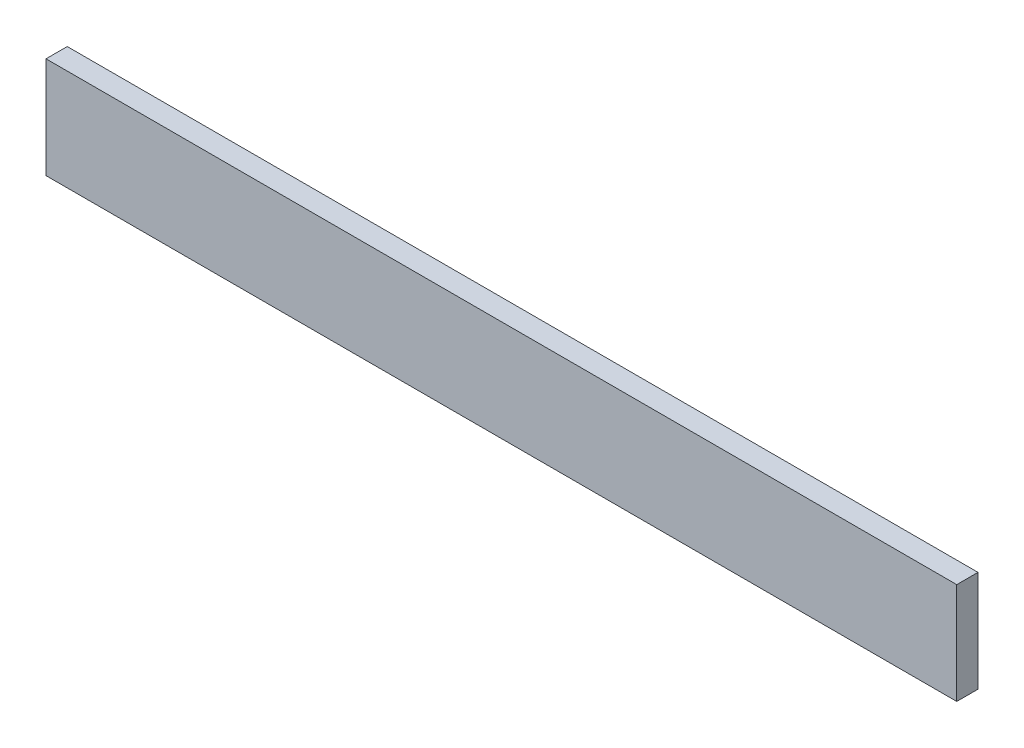
ISO-10303-21;
HEADER;
FILE_DESCRIPTION(('STEP AP214'),'2;1');
FILE_NAME('part.step','',(''),(''),'','','');
FILE_SCHEMA(('AUTOMOTIVE_DESIGN { 1 0 10303 214 1 1 1 1 }'));
ENDSEC;
DATA;
#1=APPLICATION_CONTEXT('core data for automotive mechanical design processes');
#2=APPLICATION_PROTOCOL_DEFINITION('international standard','automotive_design',2000,#1);
#3=PRODUCT_CONTEXT('',#1,'mechanical');
#4=PRODUCT('Part','Part','',(#3));
#5=PRODUCT_RELATED_PRODUCT_CATEGORY('part','',(#4));
#6=PRODUCT_DEFINITION_FORMATION('','',#4);
#7=PRODUCT_DEFINITION_CONTEXT('part definition',#1,'design');
#8=PRODUCT_DEFINITION('design','',#6,#7);
#9=PRODUCT_DEFINITION_SHAPE('','',#8);
#10=(LENGTH_UNIT() NAMED_UNIT(*) SI_UNIT(.MILLI.,.METRE.));
#11=(NAMED_UNIT(*) PLANE_ANGLE_UNIT() SI_UNIT($,.RADIAN.));
#12=(NAMED_UNIT(*) SI_UNIT($,.STERADIAN.) SOLID_ANGLE_UNIT());
#13=UNCERTAINTY_MEASURE_WITH_UNIT(LENGTH_MEASURE(1.E-05),#10,'distance_accuracy_value','');
#14=(GEOMETRIC_REPRESENTATION_CONTEXT(3) GLOBAL_UNCERTAINTY_ASSIGNED_CONTEXT((#13)) GLOBAL_UNIT_ASSIGNED_CONTEXT((#10,
#11,#12)) REPRESENTATION_CONTEXT('',''));
#15=CARTESIAN_POINT('',(0.,0.,0.));
#16=DIRECTION('',(0.,0.,1.));
#17=DIRECTION('',(1.,0.,0.));
#18=AXIS2_PLACEMENT_3D('',#15,#16,#17);
#19=CARTESIAN_POINT('',(-228.6,4.79782455590076,5.334));
#20=DIRECTION('',(1.,0.,0.));
#21=DIRECTION('',(0.,0.,-1.));
#22=AXIS2_PLACEMENT_3D('',#19,#20,#21);
#23=PLANE('',#22);
#24=DIRECTION('',(0.,-1.,0.));
#25=VECTOR('',#24,1.);
#26=CARTESIAN_POINT('',(-228.6,4.79782455590076,0.));
#27=LINE('',#26,#25);
#28=CARTESIAN_POINT('',(-228.6,4.79782455590076,0.));
#29=VERTEX_POINT('',#28);
#30=CARTESIAN_POINT('',(-228.6,-20.6021754440992,0.));
#31=VERTEX_POINT('',#30);
#32=EDGE_CURVE('E96',#29,#31,#27,.T.);
#33=ORIENTED_EDGE('',*,*,#32,.T.);
#34=DIRECTION('',(0.,0.,-1.));
#35=VECTOR('',#34,1.);
#36=CARTESIAN_POINT('',(-228.6,-20.6021754440992,5.334));
#37=LINE('',#36,#35);
#38=CARTESIAN_POINT('',(-228.6,-20.6021754440992,5.334));
#39=VERTEX_POINT('',#38);
#40=EDGE_CURVE('E11',#39,#31,#37,.T.);
#41=ORIENTED_EDGE('',*,*,#40,.F.);
#42=DIRECTION('',(0.,-1.,0.));
#43=VECTOR('',#42,1.);
#44=CARTESIAN_POINT('',(-228.6,4.79782455590076,5.334));
#45=LINE('',#44,#43);
#46=CARTESIAN_POINT('',(-228.6,4.79782455590076,5.334));
#47=VERTEX_POINT('',#46);
#48=EDGE_CURVE('E84',#47,#39,#45,.T.);
#49=ORIENTED_EDGE('',*,*,#48,.F.);
#50=DIRECTION('',(0.,0.,-1.));
#51=VECTOR('',#50,1.);
#52=CARTESIAN_POINT('',(-228.6,4.79782455590076,5.334));
#53=LINE('',#52,#51);
#54=EDGE_CURVE('E92',#47,#29,#53,.T.);
#55=ORIENTED_EDGE('',*,*,#54,.T.);
#56=EDGE_LOOP('',(#33,#41,#49,#55));
#57=FACE_BOUND('',#56,.T.);
#58=ADVANCED_FACE('F33',(#57),#23,.F.);
#59=CARTESIAN_POINT('',(-228.6,-20.6021754440992,5.334));
#60=DIRECTION('',(0.,1.,0.));
#61=DIRECTION('',(0.,0.,1.));
#62=AXIS2_PLACEMENT_3D('',#59,#60,#61);
#63=PLANE('',#62);
#64=DIRECTION('',(1.,0.,0.));
#65=VECTOR('',#64,1.);
#66=CARTESIAN_POINT('',(-228.6,-20.6021754440992,0.));
#67=LINE('',#66,#65);
#68=CARTESIAN_POINT('',(0.,-20.6021754440992,0.));
#69=VERTEX_POINT('',#68);
#70=EDGE_CURVE('E88',#31,#69,#67,.T.);
#71=ORIENTED_EDGE('',*,*,#70,.T.);
#72=DIRECTION('',(0.,0.,-1.));
#73=VECTOR('',#72,1.);
#74=CARTESIAN_POINT('',(0.,-20.6021754440992,5.334));
#75=LINE('',#74,#73);
#76=CARTESIAN_POINT('',(0.,-20.6021754440992,5.334));
#77=VERTEX_POINT('',#76);
#78=EDGE_CURVE('E41',#77,#69,#75,.T.);
#79=ORIENTED_EDGE('',*,*,#78,.F.);
#80=DIRECTION('',(1.,0.,0.));
#81=VECTOR('',#80,1.);
#82=CARTESIAN_POINT('',(-228.6,-20.6021754440992,5.334));
#83=LINE('',#82,#81);
#84=EDGE_CURVE('E79',#39,#77,#83,.T.);
#85=ORIENTED_EDGE('',*,*,#84,.F.);
#86=ORIENTED_EDGE('',*,*,#40,.T.);
#87=EDGE_LOOP('',(#71,#79,#85,#86));
#88=FACE_BOUND('',#87,.T.);
#89=ADVANCED_FACE('F87',(#88),#63,.F.);
#90=CARTESIAN_POINT('',(0.,4.79782455590076,5.334));
#91=DIRECTION('',(-1.,0.,0.));
#92=DIRECTION('',(0.,-1.,0.));
#93=AXIS2_PLACEMENT_3D('',#90,#91,#92);
#94=PLANE('',#93);
#95=DIRECTION('',(0.,1.,0.));
#96=VECTOR('',#95,1.);
#97=CARTESIAN_POINT('',(0.,4.79782455590076,0.));
#98=LINE('',#97,#96);
#99=CARTESIAN_POINT('',(0.,4.79782455590076,0.));
#100=VERTEX_POINT('',#99);
#101=EDGE_CURVE('E66',#69,#100,#98,.T.);
#102=ORIENTED_EDGE('',*,*,#101,.T.);
#103=DIRECTION('',(0.,0.,-1.));
#104=VECTOR('',#103,1.);
#105=CARTESIAN_POINT('',(0.,4.79782455590076,5.334));
#106=LINE('',#105,#104);
#107=CARTESIAN_POINT('',(0.,4.79782455590076,5.334));
#108=VERTEX_POINT('',#107);
#109=EDGE_CURVE('E89',#108,#100,#106,.T.);
#110=ORIENTED_EDGE('',*,*,#109,.F.);
#111=DIRECTION('',(0.,1.,0.));
#112=VECTOR('',#111,1.);
#113=CARTESIAN_POINT('',(0.,4.79782455590076,5.334));
#114=LINE('',#113,#112);
#115=EDGE_CURVE('E82',#77,#108,#114,.T.);
#116=ORIENTED_EDGE('',*,*,#115,.F.);
#117=ORIENTED_EDGE('',*,*,#78,.T.);
#118=EDGE_LOOP('',(#102,#110,#116,#117));
#119=FACE_BOUND('',#118,.T.);
#120=ADVANCED_FACE('F90',(#119),#94,.F.);
#121=CARTESIAN_POINT('',(-228.6,4.79782455590076,5.334));
#122=DIRECTION('',(0.,-1.,0.));
#123=DIRECTION('',(0.,0.,-1.));
#124=AXIS2_PLACEMENT_3D('',#121,#122,#123);
#125=PLANE('',#124);
#126=DIRECTION('',(-1.,0.,0.));
#127=VECTOR('',#126,1.);
#128=CARTESIAN_POINT('',(-228.6,4.79782455590076,0.));
#129=LINE('',#128,#127);
#130=EDGE_CURVE('E72',#100,#29,#129,.T.);
#131=ORIENTED_EDGE('',*,*,#130,.T.);
#132=ORIENTED_EDGE('',*,*,#54,.F.);
#133=DIRECTION('',(-1.,0.,0.));
#134=VECTOR('',#133,1.);
#135=CARTESIAN_POINT('',(-228.6,4.79782455590076,5.334));
#136=LINE('',#135,#134);
#137=EDGE_CURVE('E49',#108,#47,#136,.T.);
#138=ORIENTED_EDGE('',*,*,#137,.F.);
#139=ORIENTED_EDGE('',*,*,#109,.T.);
#140=EDGE_LOOP('',(#131,#132,#138,#139));
#141=FACE_BOUND('',#140,.T.);
#142=ADVANCED_FACE('F103',(#141),#125,.F.);
#143=CARTESIAN_POINT('',(0.,0.,5.334));
#144=DIRECTION('',(0.,0.,1.));
#145=DIRECTION('',(1.,0.,0.));
#146=AXIS2_PLACEMENT_3D('',#143,#144,#145);
#147=PLANE('',#146);
#148=ORIENTED_EDGE('',*,*,#48,.T.);
#149=ORIENTED_EDGE('',*,*,#84,.T.);
#150=ORIENTED_EDGE('',*,*,#115,.T.);
#151=ORIENTED_EDGE('',*,*,#137,.T.);
#152=EDGE_LOOP('',(#148,#149,#150,#151));
#153=FACE_BOUND('',#152,.T.);
#154=ADVANCED_FACE('F80',(#153),#147,.T.);
#155=CARTESIAN_POINT('',(0.,0.,0.));
#156=DIRECTION('',(0.,0.,1.));
#157=DIRECTION('',(1.,0.,0.));
#158=AXIS2_PLACEMENT_3D('',#155,#156,#157);
#159=PLANE('',#158);
#160=ORIENTED_EDGE('',*,*,#32,.F.);
#161=ORIENTED_EDGE('',*,*,#130,.F.);
#162=ORIENTED_EDGE('',*,*,#101,.F.);
#163=ORIENTED_EDGE('',*,*,#70,.F.);
#164=EDGE_LOOP('',(#160,#161,#162,#163));
#165=FACE_BOUND('',#164,.T.);
#166=ADVANCED_FACE('F106',(#165),#159,.F.);
#167=CLOSED_SHELL('',(#58,#89,#120,#142,#154,#166));
#168=MANIFOLD_SOLID_BREP('B2',#167);
#169=ADVANCED_BREP_SHAPE_REPRESENTATION('',(#18,#168),#14);
#170=SHAPE_DEFINITION_REPRESENTATION(#9,#169);
ENDSEC;
END-ISO-10303-21;
